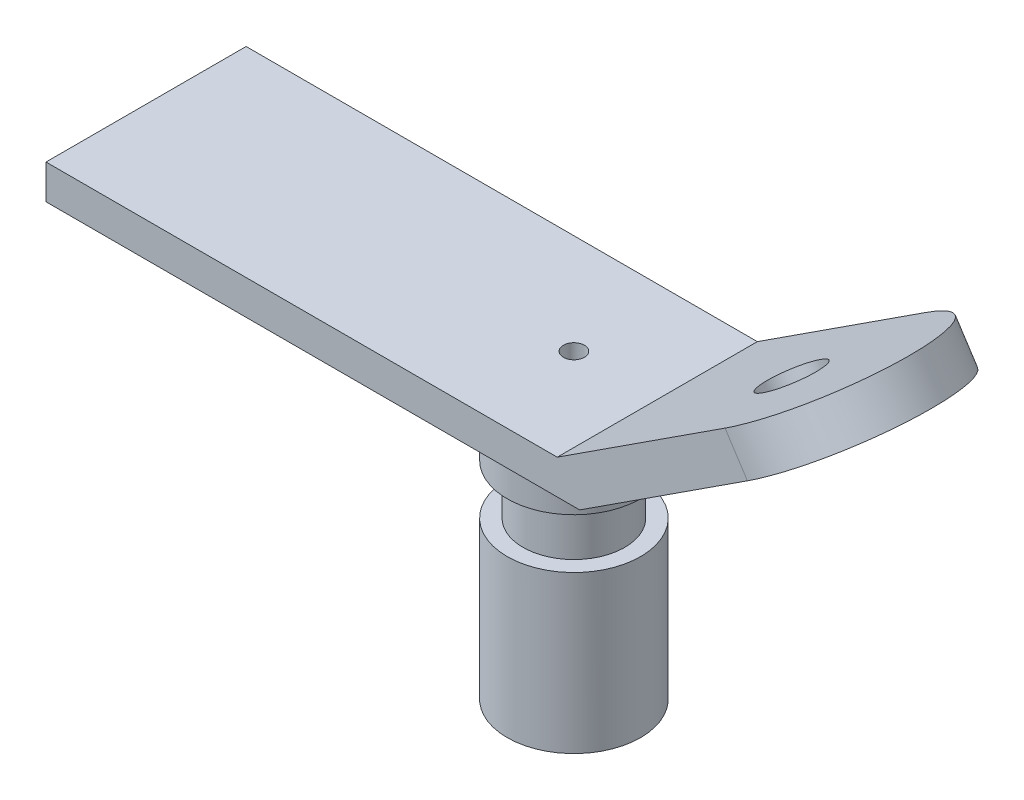
ISO-10303-21;
HEADER;
FILE_DESCRIPTION(('STEP AP214'),'2;1');
FILE_NAME('part.step','',(''),(''),'','','');
FILE_SCHEMA(('AUTOMOTIVE_DESIGN { 1 0 10303 214 1 1 1 1 }'));
ENDSEC;
DATA;
#1=APPLICATION_CONTEXT('core data for automotive mechanical design processes');
#2=APPLICATION_PROTOCOL_DEFINITION('international standard','automotive_design',2000,#1);
#3=PRODUCT_CONTEXT('',#1,'mechanical');
#4=PRODUCT('Part','Part','',(#3));
#5=PRODUCT_RELATED_PRODUCT_CATEGORY('part','',(#4));
#6=PRODUCT_DEFINITION_FORMATION('','',#4);
#7=PRODUCT_DEFINITION_CONTEXT('part definition',#1,'design');
#8=PRODUCT_DEFINITION('design','',#6,#7);
#9=PRODUCT_DEFINITION_SHAPE('','',#8);
#10=(LENGTH_UNIT() NAMED_UNIT(*) SI_UNIT(.MILLI.,.METRE.));
#11=(NAMED_UNIT(*) PLANE_ANGLE_UNIT() SI_UNIT($,.RADIAN.));
#12=(NAMED_UNIT(*) SI_UNIT($,.STERADIAN.) SOLID_ANGLE_UNIT());
#13=UNCERTAINTY_MEASURE_WITH_UNIT(LENGTH_MEASURE(1.E-05),#10,'distance_accuracy_value','');
#14=(GEOMETRIC_REPRESENTATION_CONTEXT(3) GLOBAL_UNCERTAINTY_ASSIGNED_CONTEXT((#13)) GLOBAL_UNIT_ASSIGNED_CONTEXT((#10,
#11,#12)) REPRESENTATION_CONTEXT('',''));
#15=CARTESIAN_POINT('',(0.,0.,0.));
#16=DIRECTION('',(0.,0.,1.));
#17=DIRECTION('',(1.,0.,0.));
#18=AXIS2_PLACEMENT_3D('',#15,#16,#17);
#19=CARTESIAN_POINT('',(-40.2824422143277,-101.6,38.1));
#20=DIRECTION('',(0.,1.,0.));
#21=DIRECTION('',(0.,0.,1.));
#22=AXIS2_PLACEMENT_3D('',#19,#20,#21);
#23=CYLINDRICAL_SURFACE('',#22,25.4);
#24=CARTESIAN_POINT('',(-40.2824422143277,-101.6,38.1));
#25=DIRECTION('',(0.,-1.,0.));
#26=DIRECTION('',(0.,0.,-1.));
#27=AXIS2_PLACEMENT_3D('',#24,#25,#26);
#28=CIRCLE('',#27,25.4);
#29=CARTESIAN_POINT('',(-40.2824422143277,-101.6,12.7));
#30=VERTEX_POINT('',#29);
#31=EDGE_CURVE('E119',#30,#30,#28,.T.);
#32=ORIENTED_EDGE('',*,*,#31,.F.);
#33=EDGE_LOOP('',(#32));
#34=FACE_BOUND('',#33,.T.);
#35=CARTESIAN_POINT('',(-40.2824422143277,-41.8846,38.1));
#36=DIRECTION('',(0.,1.,0.));
#37=DIRECTION('',(0.,0.,1.));
#38=AXIS2_PLACEMENT_3D('',#35,#36,#37);
#39=CIRCLE('',#38,25.4);
#40=CARTESIAN_POINT('',(-40.2824422143277,-41.8846,63.5));
#41=VERTEX_POINT('',#40);
#42=EDGE_CURVE('E137',#41,#41,#39,.T.);
#43=ORIENTED_EDGE('',*,*,#42,.F.);
#44=EDGE_LOOP('',(#43));
#45=FACE_BOUND('',#44,.T.);
#46=ADVANCED_FACE('F37',(#34,#45),#23,.T.);
#47=CARTESIAN_POINT('',(-40.2824422143277,-101.6,38.1));
#48=DIRECTION('',(0.,-1.,0.));
#49=DIRECTION('',(0.,0.,-1.));
#50=AXIS2_PLACEMENT_3D('',#47,#48,#49);
#51=PLANE('',#50);
#52=ORIENTED_EDGE('',*,*,#31,.T.);
#53=EDGE_LOOP('',(#52));
#54=FACE_BOUND('',#53,.T.);
#55=CARTESIAN_POINT('',(-40.2824422143277,-101.6,38.1));
#56=DIRECTION('',(0.,-1.,0.));
#57=DIRECTION('',(0.,0.,-1.));
#58=AXIS2_PLACEMENT_3D('',#55,#56,#57);
#59=CIRCLE('',#58,4.0005);
#60=CARTESIAN_POINT('',(-40.2824422143277,-101.6,34.0995));
#61=VERTEX_POINT('',#60);
#62=EDGE_CURVE('E141',#61,#61,#59,.T.);
#63=ORIENTED_EDGE('',*,*,#62,.F.);
#64=EDGE_LOOP('',(#63));
#65=FACE_BOUND('',#64,.T.);
#66=ADVANCED_FACE('F194',(#54,#65),#51,.T.);
#67=CARTESIAN_POINT('',(-40.2824422143277,-101.6,38.1));
#68=DIRECTION('',(0.,1.,0.));
#69=DIRECTION('',(0.,0.,1.));
#70=AXIS2_PLACEMENT_3D('',#67,#68,#69);
#71=CYLINDRICAL_SURFACE('',#70,4.0005);
#72=ORIENTED_EDGE('',*,*,#62,.T.);
#73=EDGE_LOOP('',(#72));
#74=FACE_BOUND('',#73,.T.);
#75=CARTESIAN_POINT('',(-40.2824422143278,13.1268341758888,38.1));
#76=DIRECTION('',(0.,1.,0.));
#77=DIRECTION('',(0.,0.,1.));
#78=AXIS2_PLACEMENT_3D('',#75,#76,#77);
#79=CIRCLE('',#78,4.0005);
#80=CARTESIAN_POINT('',(-40.2824422143278,13.1268341758888,42.1005));
#81=VERTEX_POINT('',#80);
#82=EDGE_CURVE('E142',#81,#81,#79,.T.);
#83=ORIENTED_EDGE('',*,*,#82,.T.);
#84=EDGE_LOOP('',(#83));
#85=FACE_BOUND('',#84,.T.);
#86=ADVANCED_FACE('F201',(#74,#85),#71,.F.);
#87=CARTESIAN_POINT('',(-65.992567443697,-41.8846,38.1));
#88=DIRECTION('',(0.,1.,0.));
#89=DIRECTION('',(0.,0.,1.));
#90=AXIS2_PLACEMENT_3D('',#87,#88,#89);
#91=PLANE('',#90);
#92=CARTESIAN_POINT('',(-40.2824422143277,-41.8846,38.1));
#93=DIRECTION('',(0.,-1.,0.));
#94=DIRECTION('',(0.,0.,-1.));
#95=AXIS2_PLACEMENT_3D('',#92,#93,#94);
#96=CIRCLE('',#95,19.3601252293693);
#97=CARTESIAN_POINT('',(-40.2824422143277,-41.8846,18.7398747706307));
#98=VERTEX_POINT('',#97);
#99=EDGE_CURVE('E138',#98,#98,#96,.T.);
#100=ORIENTED_EDGE('',*,*,#99,.T.);
#101=EDGE_LOOP('',(#100));
#102=FACE_BOUND('',#101,.T.);
#103=ORIENTED_EDGE('',*,*,#42,.T.);
#104=EDGE_LOOP('',(#103));
#105=FACE_BOUND('',#104,.T.);
#106=ADVANCED_FACE('F222',(#102,#105),#91,.T.);
#107=CARTESIAN_POINT('',(-65.992567443697,-22.8346,38.1));
#108=DIRECTION('',(0.,-1.,0.));
#109=DIRECTION('',(0.,0.,-1.));
#110=AXIS2_PLACEMENT_3D('',#107,#108,#109);
#111=PLANE('',#110);
#112=CARTESIAN_POINT('',(-40.2824422143277,-22.8346,38.1));
#113=DIRECTION('',(0.,-1.,0.));
#114=DIRECTION('',(0.,0.,-1.));
#115=AXIS2_PLACEMENT_3D('',#112,#113,#114);
#116=CIRCLE('',#115,19.3601252293693);
#117=CARTESIAN_POINT('',(-40.2824422143277,-22.8346,18.7398747706307));
#118=VERTEX_POINT('',#117);
#119=EDGE_CURVE('E144',#118,#118,#116,.T.);
#120=ORIENTED_EDGE('',*,*,#119,.F.);
#121=EDGE_LOOP('',(#120));
#122=FACE_BOUND('',#121,.T.);
#123=CARTESIAN_POINT('',(-40.2824422143277,-22.8346,38.1));
#124=DIRECTION('',(0.,-1.,0.));
#125=DIRECTION('',(0.,0.,-1.));
#126=AXIS2_PLACEMENT_3D('',#123,#124,#125);
#127=CIRCLE('',#126,25.4);
#128=CARTESIAN_POINT('',(-40.2824422143277,-22.8346,12.7));
#129=VERTEX_POINT('',#128);
#130=EDGE_CURVE('E134',#129,#129,#127,.T.);
#131=ORIENTED_EDGE('',*,*,#130,.T.);
#132=EDGE_LOOP('',(#131));
#133=FACE_BOUND('',#132,.T.);
#134=ADVANCED_FACE('F219',(#122,#133),#111,.T.);
#135=CARTESIAN_POINT('',(-40.2824422143277,-101.6,38.1));
#136=DIRECTION('',(0.,-1.,0.));
#137=DIRECTION('',(0.,0.,-1.));
#138=AXIS2_PLACEMENT_3D('',#135,#136,#137);
#139=CYLINDRICAL_SURFACE('',#138,19.3601252293693);
#140=ORIENTED_EDGE('',*,*,#119,.T.);
#141=EDGE_LOOP('',(#140));
#142=FACE_BOUND('',#141,.T.);
#143=ORIENTED_EDGE('',*,*,#99,.F.);
#144=EDGE_LOOP('',(#143));
#145=FACE_BOUND('',#144,.T.);
#146=ADVANCED_FACE('F221',(#142,#145),#139,.T.);
#147=CARTESIAN_POINT('',(-8.53244221432774,13.1268341758888,76.2));
#148=DIRECTION('',(0.544988350595414,-0.838443616300637,0.));
#149=DIRECTION('',(0.838443616300637,0.544988350595414,0.));
#150=AXIS2_PLACEMENT_3D('',#147,#148,#149);
#151=PLANE('',#150);
#152=CARTESIAN_POINT('',(42.6216735710671,46.3770094363955,38.1));
#153=DIRECTION('',(-0.544988350595415,0.838443616300637,0.));
#154=DIRECTION('',(-0.838443616300637,-0.544988350595415,0.));
#155=AXIS2_PLACEMENT_3D('',#152,#153,#154);
#156=CIRCLE('',#155,10.9982);
#157=CARTESIAN_POINT('',(33.4003029902695,40.3831185588771,38.1));
#158=VERTEX_POINT('',#157);
#159=EDGE_CURVE('E147',#158,#158,#156,.T.);
#160=ORIENTED_EDGE('',*,*,#159,.F.);
#161=EDGE_LOOP('',(#160));
#162=FACE_BOUND('',#161,.T.);
#163=DIRECTION('',(-0.838443616300637,-0.544988350595414,0.));
#164=VECTOR('',#163,1.);
#165=CARTESIAN_POINT('',(-8.53244221432774,13.1268341758888,76.2));
#166=LINE('',#165,#164);
#167=CARTESIAN_POINT('',(55.3569613477808,54.6549464912594,76.2));
#168=VERTEX_POINT('',#167);
#169=CARTESIAN_POINT('',(-8.53244221432774,13.1268341758888,76.2));
#170=VERTEX_POINT('',#169);
#171=EDGE_CURVE('E60',#168,#170,#166,.T.);
#172=ORIENTED_EDGE('',*,*,#171,.F.);
#173=CARTESIAN_POINT('',(55.3569613477808,54.6549464912594,38.1));
#174=DIRECTION('',(0.544988350595415,-0.838443616300637,0.));
#175=DIRECTION('',(0.838443616300637,0.544988350595415,0.));
#176=AXIS2_PLACEMENT_3D('',#173,#174,#175);
#177=CIRCLE('',#176,38.1);
#178=CARTESIAN_POINT('',(55.3569613477808,54.6549464912594,0.));
#179=VERTEX_POINT('',#178);
#180=EDGE_CURVE('E96',#179,#168,#177,.T.);
#181=ORIENTED_EDGE('',*,*,#180,.F.);
#182=DIRECTION('',(-0.838443616300637,-0.544988350595414,0.));
#183=VECTOR('',#182,1.);
#184=CARTESIAN_POINT('',(-8.53244221432774,13.1268341758888,0.));
#185=LINE('',#184,#183);
#186=CARTESIAN_POINT('',(-8.53244221432774,13.1268341758888,0.));
#187=VERTEX_POINT('',#186);
#188=EDGE_CURVE('E82',#179,#187,#185,.T.);
#189=ORIENTED_EDGE('',*,*,#188,.T.);
#190=DIRECTION('',(0.,0.,-1.));
#191=VECTOR('',#190,1.);
#192=CARTESIAN_POINT('',(-8.53244221432774,13.1268341758888,76.2));
#193=LINE('',#192,#191);
#194=EDGE_CURVE('E107',#170,#187,#193,.T.);
#195=ORIENTED_EDGE('',*,*,#194,.F.);
#196=EDGE_LOOP('',(#172,#181,#189,#195));
#197=FACE_BOUND('',#196,.T.);
#198=ADVANCED_FACE('F106',(#162,#197),#151,.F.);
#199=CARTESIAN_POINT('',(0.,13.1268341758888,76.2));
#200=DIRECTION('',(0.,1.,0.));
#201=DIRECTION('',(0.,0.,1.));
#202=AXIS2_PLACEMENT_3D('',#199,#200,#201);
#203=PLANE('',#202);
#204=ORIENTED_EDGE('',*,*,#82,.F.);
#205=EDGE_LOOP('',(#204));
#206=FACE_BOUND('',#205,.T.);
#207=DIRECTION('',(1.,0.,0.));
#208=VECTOR('',#207,1.);
#209=CARTESIAN_POINT('',(0.,13.1268341758888,0.));
#210=LINE('',#209,#208);
#211=CARTESIAN_POINT('',(-203.2,13.1268341758888,0.));
#212=VERTEX_POINT('',#211);
#213=EDGE_CURVE('E115',#212,#187,#210,.T.);
#214=ORIENTED_EDGE('',*,*,#213,.F.);
#215=DIRECTION('',(0.,0.,-1.));
#216=VECTOR('',#215,1.);
#217=CARTESIAN_POINT('',(-203.2,13.1268341758888,76.2));
#218=LINE('',#217,#216);
#219=CARTESIAN_POINT('',(-203.2,13.1268341758888,76.2));
#220=VERTEX_POINT('',#219);
#221=EDGE_CURVE('E45',#220,#212,#218,.T.);
#222=ORIENTED_EDGE('',*,*,#221,.F.);
#223=DIRECTION('',(1.,0.,0.));
#224=VECTOR('',#223,1.);
#225=CARTESIAN_POINT('',(0.,13.1268341758888,76.2));
#226=LINE('',#225,#224);
#227=EDGE_CURVE('E128',#220,#170,#226,.T.);
#228=ORIENTED_EDGE('',*,*,#227,.T.);
#229=ORIENTED_EDGE('',*,*,#194,.T.);
#230=EDGE_LOOP('',(#214,#222,#228,#229));
#231=FACE_BOUND('',#230,.T.);
#232=ADVANCED_FACE('F39',(#206,#231),#203,.T.);
#233=CARTESIAN_POINT('',(-203.2,0.,76.2));
#234=DIRECTION('',(-1.,0.,0.));
#235=DIRECTION('',(0.,0.,1.));
#236=AXIS2_PLACEMENT_3D('',#233,#234,#235);
#237=PLANE('',#236);
#238=DIRECTION('',(0.,1.,0.));
#239=VECTOR('',#238,1.);
#240=CARTESIAN_POINT('',(-203.2,0.,0.));
#241=LINE('',#240,#239);
#242=CARTESIAN_POINT('',(-203.2,0.,0.));
#243=VERTEX_POINT('',#242);
#244=EDGE_CURVE('E118',#243,#212,#241,.T.);
#245=ORIENTED_EDGE('',*,*,#244,.F.);
#246=DIRECTION('',(0.,0.,-1.));
#247=VECTOR('',#246,1.);
#248=CARTESIAN_POINT('',(-203.2,0.,76.2));
#249=LINE('',#248,#247);
#250=CARTESIAN_POINT('',(-203.2,0.,76.2));
#251=VERTEX_POINT('',#250);
#252=EDGE_CURVE('E131',#251,#243,#249,.T.);
#253=ORIENTED_EDGE('',*,*,#252,.F.);
#254=DIRECTION('',(0.,1.,0.));
#255=VECTOR('',#254,1.);
#256=CARTESIAN_POINT('',(-203.2,0.,76.2));
#257=LINE('',#256,#255);
#258=EDGE_CURVE('E168',#251,#220,#257,.T.);
#259=ORIENTED_EDGE('',*,*,#258,.T.);
#260=ORIENTED_EDGE('',*,*,#221,.T.);
#261=EDGE_LOOP('',(#245,#253,#259,#260));
#262=FACE_BOUND('',#261,.T.);
#263=ADVANCED_FACE('F177',(#262),#237,.T.);
#264=CARTESIAN_POINT('',(0.,0.,76.2));
#265=DIRECTION('',(0.,0.,1.));
#266=DIRECTION('',(1.,0.,0.));
#267=AXIS2_PLACEMENT_3D('',#264,#265,#266);
#268=PLANE('',#267);
#269=DIRECTION('',(-0.544988350595415,0.838443616300637,0.));
#270=VECTOR('',#269,1.);
#271=CARTESIAN_POINT('',(148.266588806384,-88.2829419065916,76.2));
#272=LINE('',#271,#270);
#273=CARTESIAN_POINT('',(63.8894035621085,41.5281123153706,76.2));
#274=VERTEX_POINT('',#273);
#275=EDGE_CURVE('E98',#274,#168,#272,.T.);
#276=ORIENTED_EDGE('',*,*,#275,.T.);
#277=ORIENTED_EDGE('',*,*,#171,.T.);
#278=ORIENTED_EDGE('',*,*,#227,.F.);
#279=ORIENTED_EDGE('',*,*,#258,.F.);
#280=DIRECTION('',(-1.,0.,0.));
#281=VECTOR('',#280,1.);
#282=CARTESIAN_POINT('',(0.,0.,76.2));
#283=LINE('',#282,#281);
#284=CARTESIAN_POINT('',(0.,0.,76.2));
#285=VERTEX_POINT('',#284);
#286=EDGE_CURVE('E111',#285,#251,#283,.T.);
#287=ORIENTED_EDGE('',*,*,#286,.F.);
#288=DIRECTION('',(0.838443616300637,0.544988350595415,0.));
#289=VECTOR('',#288,1.);
#290=CARTESIAN_POINT('',(0.,0.,76.2));
#291=LINE('',#290,#289);
#292=EDGE_CURVE('E104',#285,#274,#291,.T.);
#293=ORIENTED_EDGE('',*,*,#292,.T.);
#294=EDGE_LOOP('',(#276,#277,#278,#279,#287,#293));
#295=FACE_BOUND('',#294,.T.);
#296=ADVANCED_FACE('F101',(#295),#268,.T.);
#297=CARTESIAN_POINT('',(0.,0.,76.2));
#298=DIRECTION('',(-0.544988350595415,0.838443616300637,0.));
#299=DIRECTION('',(-0.838443616300637,-0.544988350595415,0.));
#300=AXIS2_PLACEMENT_3D('',#297,#298,#299);
#301=PLANE('',#300);
#302=CARTESIAN_POINT('',(51.1541157853949,33.2501752605067,38.1));
#303=DIRECTION('',(-0.544988350595415,0.838443616300637,0.));
#304=DIRECTION('',(-0.838443616300637,-0.544988350595415,0.));
#305=AXIS2_PLACEMENT_3D('',#302,#303,#304);
#306=CIRCLE('',#305,10.9982);
#307=CARTESIAN_POINT('',(41.9327452045972,27.2562843829883,38.1));
#308=VERTEX_POINT('',#307);
#309=EDGE_CURVE('E145',#308,#308,#306,.T.);
#310=ORIENTED_EDGE('',*,*,#309,.T.);
#311=EDGE_LOOP('',(#310));
#312=FACE_BOUND('',#311,.T.);
#313=DIRECTION('',(0.838443616300637,0.544988350595415,0.));
#314=VECTOR('',#313,1.);
#315=CARTESIAN_POINT('',(0.,0.,0.));
#316=LINE('',#315,#314);
#317=CARTESIAN_POINT('',(0.,0.,0.));
#318=VERTEX_POINT('',#317);
#319=CARTESIAN_POINT('',(63.8894035621085,41.5281123153706,0.));
#320=VERTEX_POINT('',#319);
#321=EDGE_CURVE('E125',#318,#320,#316,.T.);
#322=ORIENTED_EDGE('',*,*,#321,.T.);
#323=CARTESIAN_POINT('',(63.8894035621085,41.5281123153706,38.1));
#324=DIRECTION('',(-0.544988350595415,0.838443616300637,0.));
#325=DIRECTION('',(-0.838443616300637,-0.544988350595415,0.));
#326=AXIS2_PLACEMENT_3D('',#323,#324,#325);
#327=CIRCLE('',#326,38.1);
#328=EDGE_CURVE('E52',#320,#274,#327,.F.);
#329=ORIENTED_EDGE('',*,*,#328,.T.);
#330=ORIENTED_EDGE('',*,*,#292,.F.);
#331=DIRECTION('',(0.,0.,-1.));
#332=VECTOR('',#331,1.);
#333=CARTESIAN_POINT('',(0.,0.,76.2));
#334=LINE('',#333,#332);
#335=EDGE_CURVE('E109',#285,#318,#334,.T.);
#336=ORIENTED_EDGE('',*,*,#335,.T.);
#337=EDGE_LOOP('',(#322,#329,#330,#336));
#338=FACE_BOUND('',#337,.T.);
#339=ADVANCED_FACE('F182',(#312,#338),#301,.F.);
#340=CARTESIAN_POINT('',(0.,0.,0.));
#341=DIRECTION('',(0.,0.,1.));
#342=DIRECTION('',(1.,0.,0.));
#343=AXIS2_PLACEMENT_3D('',#340,#341,#342);
#344=PLANE('',#343);
#345=ORIENTED_EDGE('',*,*,#188,.F.);
#346=DIRECTION('',(-0.544988350595415,0.838443616300637,0.));
#347=VECTOR('',#346,1.);
#348=CARTESIAN_POINT('',(148.266588806384,-88.2829419065916,0.));
#349=LINE('',#348,#347);
#350=EDGE_CURVE('E11',#179,#320,#349,.F.);
#351=ORIENTED_EDGE('',*,*,#350,.T.);
#352=ORIENTED_EDGE('',*,*,#321,.F.);
#353=DIRECTION('',(-1.,0.,0.));
#354=VECTOR('',#353,1.);
#355=CARTESIAN_POINT('',(0.,0.,0.));
#356=LINE('',#355,#354);
#357=EDGE_CURVE('E122',#318,#243,#356,.T.);
#358=ORIENTED_EDGE('',*,*,#357,.T.);
#359=ORIENTED_EDGE('',*,*,#244,.T.);
#360=ORIENTED_EDGE('',*,*,#213,.T.);
#361=EDGE_LOOP('',(#345,#351,#352,#358,#359,#360));
#362=FACE_BOUND('',#361,.T.);
#363=ADVANCED_FACE('F180',(#362),#344,.F.);
#364=CARTESIAN_POINT('',(0.,0.,76.2));
#365=DIRECTION('',(0.,-1.,0.));
#366=DIRECTION('',(1.,0.,0.));
#367=AXIS2_PLACEMENT_3D('',#364,#365,#366);
#368=PLANE('',#367);
#369=CARTESIAN_POINT('',(-40.2824422143277,0.,38.1));
#370=DIRECTION('',(0.,-1.,0.));
#371=DIRECTION('',(0.,0.,-1.));
#372=AXIS2_PLACEMENT_3D('',#369,#370,#371);
#373=CIRCLE('',#372,25.4);
#374=CARTESIAN_POINT('',(-40.2824422143277,0.,12.7));
#375=VERTEX_POINT('',#374);
#376=EDGE_CURVE('E162',#375,#375,#373,.T.);
#377=ORIENTED_EDGE('',*,*,#376,.F.);
#378=EDGE_LOOP('',(#377));
#379=FACE_BOUND('',#378,.T.);
#380=ORIENTED_EDGE('',*,*,#357,.F.);
#381=ORIENTED_EDGE('',*,*,#335,.F.);
#382=ORIENTED_EDGE('',*,*,#286,.T.);
#383=ORIENTED_EDGE('',*,*,#252,.T.);
#384=EDGE_LOOP('',(#380,#381,#382,#383));
#385=FACE_BOUND('',#384,.T.);
#386=ADVANCED_FACE('F173',(#379,#385),#368,.T.);
#387=ORIENTED_EDGE('',*,*,#376,.T.);
#388=EDGE_LOOP('',(#387));
#389=FACE_BOUND('',#388,.T.);
#390=ORIENTED_EDGE('',*,*,#130,.F.);
#391=EDGE_LOOP('',(#390));
#392=FACE_BOUND('',#391,.T.);
#393=ADVANCED_FACE('F197',(#389,#392),#23,.T.);
#394=CARTESIAN_POINT('',(135.53130102967,-96.5608789614554,38.1));
#395=DIRECTION('',(-0.544988350595415,0.838443616300637,0.));
#396=DIRECTION('',(-0.838443616300637,-0.544988350595415,0.));
#397=AXIS2_PLACEMENT_3D('',#394,#395,#396);
#398=CYLINDRICAL_SURFACE('',#397,10.9982);
#399=ORIENTED_EDGE('',*,*,#159,.T.);
#400=EDGE_LOOP('',(#399));
#401=FACE_BOUND('',#400,.T.);
#402=ORIENTED_EDGE('',*,*,#309,.F.);
#403=EDGE_LOOP('',(#402));
#404=FACE_BOUND('',#403,.T.);
#405=ADVANCED_FACE('F207',(#401,#404),#398,.F.);
#406=CARTESIAN_POINT('',(148.266588806384,-88.2829419065916,38.1));
#407=DIRECTION('',(-0.544988350595415,0.838443616300637,0.));
#408=DIRECTION('',(-0.838443616300637,-0.544988350595415,0.));
#409=AXIS2_PLACEMENT_3D('',#406,#407,#408);
#410=CYLINDRICAL_SURFACE('',#409,38.1);
#411=ORIENTED_EDGE('',*,*,#350,.F.);
#412=ORIENTED_EDGE('',*,*,#180,.T.);
#413=ORIENTED_EDGE('',*,*,#275,.F.);
#414=ORIENTED_EDGE('',*,*,#328,.F.);
#415=EDGE_LOOP('',(#411,#412,#413,#414));
#416=FACE_BOUND('',#415,.T.);
#417=ADVANCED_FACE('F97',(#416),#410,.T.);
#418=CLOSED_SHELL('',(#46,#66,#86,#106,#134,#146,#198,#232,#263,#296,#339,#363,#386,#393,#405,#417));
#419=MANIFOLD_SOLID_BREP('B2',#418);
#420=ADVANCED_BREP_SHAPE_REPRESENTATION('',(#18,#419),#14);
#421=SHAPE_DEFINITION_REPRESENTATION(#9,#420);
ENDSEC;
END-ISO-10303-21;
